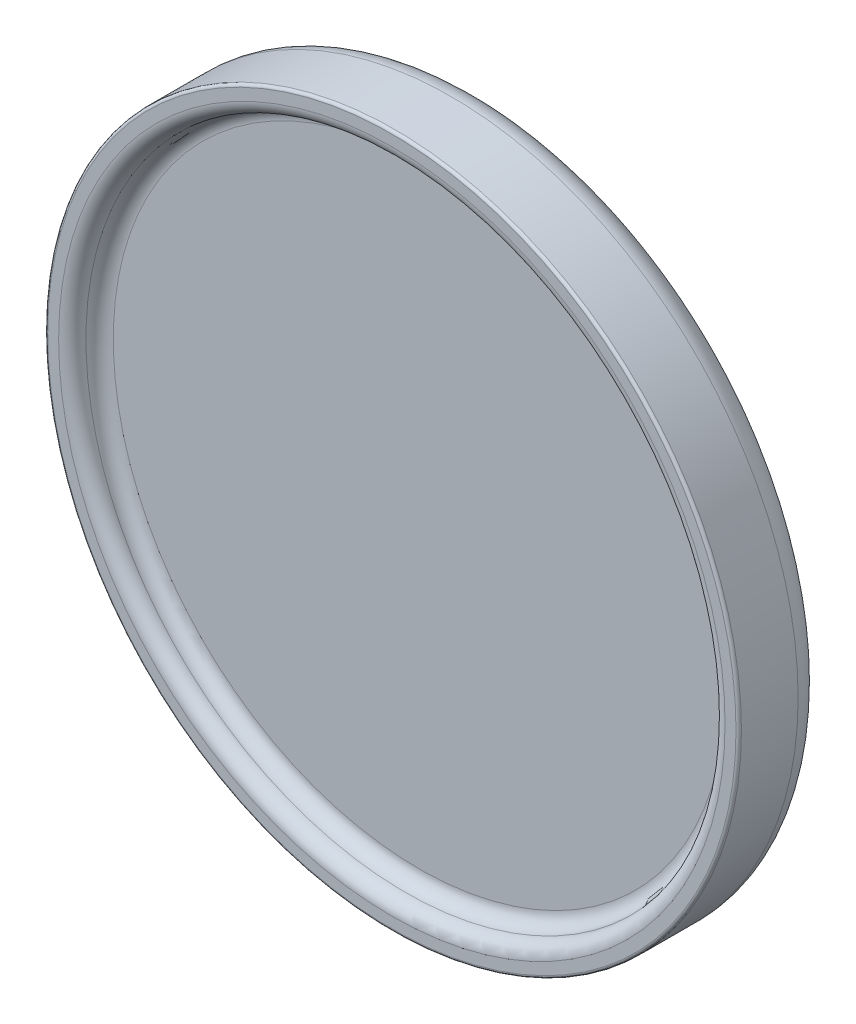
ISO-10303-21;
HEADER;
FILE_DESCRIPTION(('STEP AP214'),'2;1');
FILE_NAME('part.step','',(''),(''),'','','');
FILE_SCHEMA(('AUTOMOTIVE_DESIGN { 1 0 10303 214 1 1 1 1 }'));
ENDSEC;
DATA;
#1=APPLICATION_CONTEXT('core data for automotive mechanical design processes');
#2=APPLICATION_PROTOCOL_DEFINITION('international standard','automotive_design',2000,#1);
#3=PRODUCT_CONTEXT('',#1,'mechanical');
#4=PRODUCT('Part','Part','',(#3));
#5=PRODUCT_RELATED_PRODUCT_CATEGORY('part','',(#4));
#6=PRODUCT_DEFINITION_FORMATION('','',#4);
#7=PRODUCT_DEFINITION_CONTEXT('part definition',#1,'design');
#8=PRODUCT_DEFINITION('design','',#6,#7);
#9=PRODUCT_DEFINITION_SHAPE('','',#8);
#10=(LENGTH_UNIT() NAMED_UNIT(*) SI_UNIT(.MILLI.,.METRE.));
#11=(NAMED_UNIT(*) PLANE_ANGLE_UNIT() SI_UNIT($,.RADIAN.));
#12=(NAMED_UNIT(*) SI_UNIT($,.STERADIAN.) SOLID_ANGLE_UNIT());
#13=UNCERTAINTY_MEASURE_WITH_UNIT(LENGTH_MEASURE(1.E-05),#10,'distance_accuracy_value','');
#14=(GEOMETRIC_REPRESENTATION_CONTEXT(3) GLOBAL_UNCERTAINTY_ASSIGNED_CONTEXT((#13)) GLOBAL_UNIT_ASSIGNED_CONTEXT((#10,
#11,#12)) REPRESENTATION_CONTEXT('',''));
#15=CARTESIAN_POINT('',(0.,0.,0.));
#16=DIRECTION('',(0.,0.,1.));
#17=DIRECTION('',(1.,0.,0.));
#18=AXIS2_PLACEMENT_3D('',#15,#16,#17);
#19=CARTESIAN_POINT('',(0.,0.,-34.1534007671264));
#20=DIRECTION('',(0.,0.,1.));
#21=DIRECTION('',(1.,0.,0.));
#22=AXIS2_PLACEMENT_3D('',#19,#20,#21);
#23=CYLINDRICAL_SURFACE('',#22,152.4);
#24=CARTESIAN_POINT('',(0.,0.,-22.1534007671264));
#25=DIRECTION('',(0.,0.,1.));
#26=DIRECTION('',(1.,0.,0.));
#27=AXIS2_PLACEMENT_3D('',#24,#25,#26);
#28=CIRCLE('',#27,152.4);
#29=CARTESIAN_POINT('',(152.4,0.,-22.1534007671264));
#30=VERTEX_POINT('',#29);
#31=EDGE_CURVE('E2094',#30,#30,#28,.T.);
#32=ORIENTED_EDGE('',*,*,#31,.T.);
#33=EDGE_LOOP('',(#32));
#34=FACE_BOUND('',#33,.T.);
#35=CARTESIAN_POINT('',(0.,0.,2.74659923287364));
#36=DIRECTION('',(0.,0.,1.));
#37=DIRECTION('',(1.,0.,0.));
#38=AXIS2_PLACEMENT_3D('',#35,#36,#37);
#39=CIRCLE('',#38,152.4);
#40=CARTESIAN_POINT('',(152.4,0.,2.74659923287364));
#41=VERTEX_POINT('',#40);
#42=EDGE_CURVE('E2098',#41,#41,#39,.F.);
#43=ORIENTED_EDGE('',*,*,#42,.T.);
#44=EDGE_LOOP('',(#43));
#45=FACE_BOUND('',#44,.T.);
#46=ADVANCED_FACE('F2088',(#34,#45),#23,.T.);
#47=CARTESIAN_POINT('',(0.,0.,-34.1534007671264));
#48=DIRECTION('',(0.,0.,1.));
#49=DIRECTION('',(1.,0.,0.));
#50=AXIS2_PLACEMENT_3D('',#47,#48,#49);
#51=PLANE('',#50);
#52=CARTESIAN_POINT('',(0.,0.,-34.1534007671264));
#53=DIRECTION('',(0.,0.,1.));
#54=DIRECTION('',(1.,0.,0.));
#55=AXIS2_PLACEMENT_3D('',#52,#53,#54);
#56=CIRCLE('',#55,140.4);
#57=CARTESIAN_POINT('',(140.4,0.,-34.1534007671264));
#58=VERTEX_POINT('',#57);
#59=EDGE_CURVE('E11',#58,#58,#56,.F.);
#60=ORIENTED_EDGE('',*,*,#59,.T.);
#61=EDGE_LOOP('',(#60));
#62=FACE_BOUND('',#61,.T.);
#63=ADVANCED_FACE('F2136',(#62),#51,.F.);
#64=CARTESIAN_POINT('',(0.,0.,3.94659923287364));
#65=DIRECTION('',(0.,0.,1.));
#66=DIRECTION('',(1.,0.,0.));
#67=AXIS2_PLACEMENT_3D('',#64,#65,#66);
#68=PLANE('',#67);
#69=CARTESIAN_POINT('',(0.,0.,3.94659923287364));
#70=DIRECTION('',(0.,0.,1.));
#71=DIRECTION('',(1.,0.,0.));
#72=AXIS2_PLACEMENT_3D('',#69,#70,#71);
#73=CIRCLE('',#72,151.2);
#74=CARTESIAN_POINT('',(151.2,0.,3.94659923287364));
#75=VERTEX_POINT('',#74);
#76=EDGE_CURVE('E2102',#75,#75,#73,.T.);
#77=ORIENTED_EDGE('',*,*,#76,.T.);
#78=EDGE_LOOP('',(#77));
#79=FACE_BOUND('',#78,.T.);
#80=CARTESIAN_POINT('',(0.,0.,3.94659923287364));
#81=DIRECTION('',(0.,0.,1.));
#82=DIRECTION('',(1.,0.,0.));
#83=AXIS2_PLACEMENT_3D('',#80,#81,#82);
#84=CIRCLE('',#83,146.4);
#85=CARTESIAN_POINT('',(146.4,0.,3.94659923287364));
#86=VERTEX_POINT('',#85);
#87=EDGE_CURVE('E2110',#86,#86,#84,.F.);
#88=ORIENTED_EDGE('',*,*,#87,.T.);
#89=EDGE_LOOP('',(#88));
#90=FACE_BOUND('',#89,.T.);
#91=ADVANCED_FACE('F2131',(#79,#90),#68,.T.);
#92=CARTESIAN_POINT('',(0.,0.,-8.05340076712633));
#93=DIRECTION('',(0.,0.,1.));
#94=DIRECTION('',(1.,0.,0.));
#95=AXIS2_PLACEMENT_3D('',#92,#93,#94);
#96=PLANE('',#95);
#97=CARTESIAN_POINT('',(0.,0.,-8.05340076712633));
#98=DIRECTION('',(0.,0.,1.));
#99=DIRECTION('',(1.,0.,0.));
#100=AXIS2_PLACEMENT_3D('',#97,#98,#99);
#101=CIRCLE('',#100,134.4);
#102=CARTESIAN_POINT('',(134.4,0.,-8.05340076712633));
#103=VERTEX_POINT('',#102);
#104=EDGE_CURVE('E2107',#103,#103,#101,.T.);
#105=ORIENTED_EDGE('',*,*,#104,.T.);
#106=EDGE_LOOP('',(#105));
#107=FACE_BOUND('',#106,.T.);
#108=ADVANCED_FACE('F2122',(#107),#96,.T.);
#109=CARTESIAN_POINT('',(0.,0.,-2.05340076712636));
#110=DIRECTION('',(0.,0.,1.));
#111=DIRECTION('',(1.,0.,0.));
#112=AXIS2_PLACEMENT_3D('',#109,#110,#111);
#113=TOROIDAL_SURFACE('',#112,146.4,6.);
#114=ORIENTED_EDGE('',*,*,#87,.F.);
#115=EDGE_LOOP('',(#114));
#116=FACE_BOUND('',#115,.T.);
#117=CARTESIAN_POINT('',(0.,0.,-2.05340076712636));
#118=DIRECTION('',(0.,0.,1.));
#119=DIRECTION('',(1.,0.,0.));
#120=AXIS2_PLACEMENT_3D('',#117,#118,#119);
#121=CIRCLE('',#120,140.4);
#122=CARTESIAN_POINT('',(140.4,0.,-2.05340076712636));
#123=VERTEX_POINT('',#122);
#124=EDGE_CURVE('E2113',#123,#123,#121,.T.);
#125=ORIENTED_EDGE('',*,*,#124,.F.);
#126=EDGE_LOOP('',(#125));
#127=FACE_BOUND('',#126,.T.);
#128=ADVANCED_FACE('F2120',(#116,#127),#113,.T.);
#129=CARTESIAN_POINT('',(0.,0.,-2.05340076712633));
#130=DIRECTION('',(0.,0.,1.));
#131=DIRECTION('',(1.,0.,0.));
#132=AXIS2_PLACEMENT_3D('',#129,#130,#131);
#133=TOROIDAL_SURFACE('',#132,134.4,6.);
#134=ORIENTED_EDGE('',*,*,#124,.T.);
#135=EDGE_LOOP('',(#134));
#136=FACE_BOUND('',#135,.T.);
#137=ORIENTED_EDGE('',*,*,#104,.F.);
#138=EDGE_LOOP('',(#137));
#139=FACE_BOUND('',#138,.T.);
#140=ADVANCED_FACE('F2117',(#136,#139),#133,.F.);
#141=CARTESIAN_POINT('',(0.,0.,2.74659923287364));
#142=DIRECTION('',(0.,0.,1.));
#143=DIRECTION('',(1.,0.,0.));
#144=AXIS2_PLACEMENT_3D('',#141,#142,#143);
#145=TOROIDAL_SURFACE('',#144,151.2,1.2);
#146=ORIENTED_EDGE('',*,*,#42,.F.);
#147=EDGE_LOOP('',(#146));
#148=FACE_BOUND('',#147,.T.);
#149=ORIENTED_EDGE('',*,*,#76,.F.);
#150=EDGE_LOOP('',(#149));
#151=FACE_BOUND('',#150,.T.);
#152=ADVANCED_FACE('F2129',(#148,#151),#145,.T.);
#153=CARTESIAN_POINT('',(0.,0.,-22.1534007671264));
#154=DIRECTION('',(0.,0.,1.));
#155=DIRECTION('',(1.,0.,0.));
#156=AXIS2_PLACEMENT_3D('',#153,#154,#155);
#157=TOROIDAL_SURFACE('',#156,140.4,12.);
#158=ORIENTED_EDGE('',*,*,#59,.F.);
#159=EDGE_LOOP('',(#158));
#160=FACE_BOUND('',#159,.T.);
#161=ORIENTED_EDGE('',*,*,#31,.F.);
#162=EDGE_LOOP('',(#161));
#163=FACE_BOUND('',#162,.T.);
#164=ADVANCED_FACE('F2145',(#160,#163),#157,.T.);
#165=CLOSED_SHELL('',(#46,#63,#91,#108,#128,#140,#152,#164));
#166=MANIFOLD_SOLID_BREP('B2',#165);
#167=ADVANCED_BREP_SHAPE_REPRESENTATION('',(#18,#166),#14);
#168=SHAPE_DEFINITION_REPRESENTATION(#9,#167);
ENDSEC;
END-ISO-10303-21;
